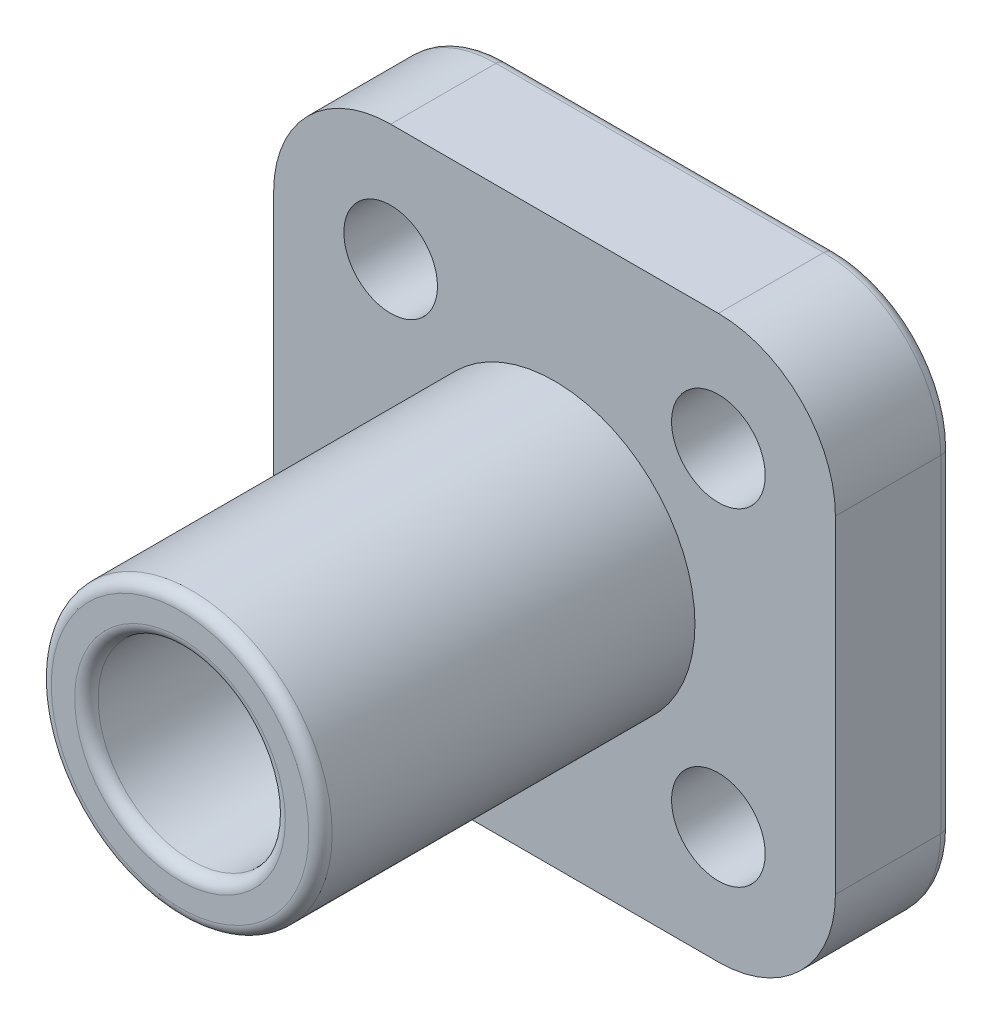
ISO-10303-21;
HEADER;
FILE_DESCRIPTION(('STEP AP214'),'2;1');
FILE_NAME('part.step','',(''),(''),'','','');
FILE_SCHEMA(('AUTOMOTIVE_DESIGN { 1 0 10303 214 1 1 1 1 }'));
ENDSEC;
DATA;
#1=APPLICATION_CONTEXT('core data for automotive mechanical design processes');
#2=APPLICATION_PROTOCOL_DEFINITION('international standard','automotive_design',2000,#1);
#3=PRODUCT_CONTEXT('',#1,'mechanical');
#4=PRODUCT('Part','Part','',(#3));
#5=PRODUCT_RELATED_PRODUCT_CATEGORY('part','',(#4));
#6=PRODUCT_DEFINITION_FORMATION('','',#4);
#7=PRODUCT_DEFINITION_CONTEXT('part definition',#1,'design');
#8=PRODUCT_DEFINITION('design','',#6,#7);
#9=PRODUCT_DEFINITION_SHAPE('','',#8);
#10=(LENGTH_UNIT() NAMED_UNIT(*) SI_UNIT(.MILLI.,.METRE.));
#11=(NAMED_UNIT(*) PLANE_ANGLE_UNIT() SI_UNIT($,.RADIAN.));
#12=(NAMED_UNIT(*) SI_UNIT($,.STERADIAN.) SOLID_ANGLE_UNIT());
#13=UNCERTAINTY_MEASURE_WITH_UNIT(LENGTH_MEASURE(1.E-05),#10,'distance_accuracy_value','');
#14=(GEOMETRIC_REPRESENTATION_CONTEXT(3) GLOBAL_UNCERTAINTY_ASSIGNED_CONTEXT((#13)) GLOBAL_UNIT_ASSIGNED_CONTEXT((#10,
#11,#12)) REPRESENTATION_CONTEXT('',''));
#15=CARTESIAN_POINT('',(0.,0.,0.));
#16=DIRECTION('',(0.,0.,1.));
#17=DIRECTION('',(1.,0.,0.));
#18=AXIS2_PLACEMENT_3D('',#15,#16,#17);
#19=CARTESIAN_POINT('',(7.,-7.,5.));
#20=DIRECTION('',(0.,0.,1.));
#21=DIRECTION('',(1.,0.,0.));
#22=AXIS2_PLACEMENT_3D('',#19,#20,#21);
#23=PLANE('',#22);
#24=CARTESIAN_POINT('',(0.,0.,5.));
#25=DIRECTION('',(0.,0.,1.));
#26=DIRECTION('',(1.,0.,0.));
#27=AXIS2_PLACEMENT_3D('',#24,#25,#26);
#28=CIRCLE('',#27,6.);
#29=CARTESIAN_POINT('',(6.,0.,5.));
#30=VERTEX_POINT('',#29);
#31=EDGE_CURVE('E252',#30,#30,#28,.T.);
#32=ORIENTED_EDGE('',*,*,#31,.F.);
#33=EDGE_LOOP('',(#32));
#34=FACE_BOUND('',#33,.T.);
#35=CARTESIAN_POINT('',(7.,-7.,5.));
#36=DIRECTION('',(0.,0.,1.));
#37=DIRECTION('',(1.,0.,0.));
#38=AXIS2_PLACEMENT_3D('',#35,#36,#37);
#39=CIRCLE('',#38,2.);
#40=CARTESIAN_POINT('',(9.,-7.,5.));
#41=VERTEX_POINT('',#40);
#42=EDGE_CURVE('E262',#41,#41,#39,.T.);
#43=ORIENTED_EDGE('',*,*,#42,.F.);
#44=EDGE_LOOP('',(#43));
#45=FACE_BOUND('',#44,.T.);
#46=CARTESIAN_POINT('',(-7.,7.,5.));
#47=DIRECTION('',(0.,0.,1.));
#48=DIRECTION('',(1.,0.,0.));
#49=AXIS2_PLACEMENT_3D('',#46,#47,#48);
#50=CIRCLE('',#49,2.);
#51=CARTESIAN_POINT('',(-5.,7.,5.));
#52=VERTEX_POINT('',#51);
#53=EDGE_CURVE('E152',#52,#52,#50,.T.);
#54=ORIENTED_EDGE('',*,*,#53,.F.);
#55=EDGE_LOOP('',(#54));
#56=FACE_BOUND('',#55,.T.);
#57=CARTESIAN_POINT('',(7.,-7.,5.));
#58=DIRECTION('',(0.,0.,1.));
#59=DIRECTION('',(1.,0.,0.));
#60=AXIS2_PLACEMENT_3D('',#57,#58,#59);
#61=CIRCLE('',#60,5.);
#62=CARTESIAN_POINT('',(7.,-12.,5.));
#63=VERTEX_POINT('',#62);
#64=CARTESIAN_POINT('',(12.,-7.,5.));
#65=VERTEX_POINT('',#64);
#66=EDGE_CURVE('E145',#63,#65,#61,.T.);
#67=ORIENTED_EDGE('',*,*,#66,.T.);
#68=DIRECTION('',(0.,1.,0.));
#69=VECTOR('',#68,1.);
#70=CARTESIAN_POINT('',(12.,-7.,5.));
#71=LINE('',#70,#69);
#72=CARTESIAN_POINT('',(12.,7.,5.));
#73=VERTEX_POINT('',#72);
#74=EDGE_CURVE('E133',#65,#73,#71,.T.);
#75=ORIENTED_EDGE('',*,*,#74,.T.);
#76=CARTESIAN_POINT('',(7.,7.,5.));
#77=DIRECTION('',(0.,0.,1.));
#78=DIRECTION('',(1.,0.,0.));
#79=AXIS2_PLACEMENT_3D('',#76,#77,#78);
#80=CIRCLE('',#79,5.);
#81=CARTESIAN_POINT('',(7.,12.,5.));
#82=VERTEX_POINT('',#81);
#83=EDGE_CURVE('E144',#73,#82,#80,.T.);
#84=ORIENTED_EDGE('',*,*,#83,.T.);
#85=DIRECTION('',(-1.,0.,0.));
#86=VECTOR('',#85,1.);
#87=CARTESIAN_POINT('',(7.,12.,5.));
#88=LINE('',#87,#86);
#89=CARTESIAN_POINT('',(-7.,12.,5.));
#90=VERTEX_POINT('',#89);
#91=EDGE_CURVE('E273',#82,#90,#88,.T.);
#92=ORIENTED_EDGE('',*,*,#91,.T.);
#93=CARTESIAN_POINT('',(-7.,7.,5.));
#94=DIRECTION('',(0.,0.,1.));
#95=DIRECTION('',(1.,0.,0.));
#96=AXIS2_PLACEMENT_3D('',#93,#94,#95);
#97=CIRCLE('',#96,5.);
#98=CARTESIAN_POINT('',(-12.,7.,5.));
#99=VERTEX_POINT('',#98);
#100=EDGE_CURVE('E275',#90,#99,#97,.T.);
#101=ORIENTED_EDGE('',*,*,#100,.T.);
#102=DIRECTION('',(0.,-1.,0.));
#103=VECTOR('',#102,1.);
#104=CARTESIAN_POINT('',(-12.,-7.,5.));
#105=LINE('',#104,#103);
#106=CARTESIAN_POINT('',(-12.,-7.,5.));
#107=VERTEX_POINT('',#106);
#108=EDGE_CURVE('E277',#99,#107,#105,.T.);
#109=ORIENTED_EDGE('',*,*,#108,.T.);
#110=CARTESIAN_POINT('',(-7.,-7.,5.));
#111=DIRECTION('',(0.,0.,1.));
#112=DIRECTION('',(-1.,0.,0.));
#113=AXIS2_PLACEMENT_3D('',#110,#111,#112);
#114=CIRCLE('',#113,5.);
#115=CARTESIAN_POINT('',(-7.,-12.,5.));
#116=VERTEX_POINT('',#115);
#117=EDGE_CURVE('E279',#107,#116,#114,.T.);
#118=ORIENTED_EDGE('',*,*,#117,.T.);
#119=DIRECTION('',(1.,0.,0.));
#120=VECTOR('',#119,1.);
#121=CARTESIAN_POINT('',(7.,-12.,5.));
#122=LINE('',#121,#120);
#123=EDGE_CURVE('E150',#116,#63,#122,.T.);
#124=ORIENTED_EDGE('',*,*,#123,.T.);
#125=EDGE_LOOP('',(#67,#75,#84,#92,#101,#109,#118,#124));
#126=FACE_BOUND('',#125,.T.);
#127=CARTESIAN_POINT('',(7.,7.,5.));
#128=DIRECTION('',(0.,0.,1.));
#129=DIRECTION('',(1.,0.,0.));
#130=AXIS2_PLACEMENT_3D('',#127,#128,#129);
#131=CIRCLE('',#130,2.);
#132=CARTESIAN_POINT('',(9.,7.,5.));
#133=VERTEX_POINT('',#132);
#134=EDGE_CURVE('E267',#133,#133,#131,.T.);
#135=ORIENTED_EDGE('',*,*,#134,.F.);
#136=EDGE_LOOP('',(#135));
#137=FACE_BOUND('',#136,.T.);
#138=CARTESIAN_POINT('',(-7.,-7.,5.));
#139=DIRECTION('',(0.,0.,1.));
#140=DIRECTION('',(1.,0.,0.));
#141=AXIS2_PLACEMENT_3D('',#138,#139,#140);
#142=CIRCLE('',#141,2.);
#143=CARTESIAN_POINT('',(-5.,-7.,5.));
#144=VERTEX_POINT('',#143);
#145=EDGE_CURVE('E257',#144,#144,#142,.T.);
#146=ORIENTED_EDGE('',*,*,#145,.F.);
#147=EDGE_LOOP('',(#146));
#148=FACE_BOUND('',#147,.T.);
#149=ADVANCED_FACE('F39',(#34,#45,#56,#126,#137,#148),#23,.T.);
#150=CARTESIAN_POINT('',(7.,-7.,0.));
#151=DIRECTION('',(0.,0.,1.));
#152=DIRECTION('',(1.,0.,0.));
#153=AXIS2_PLACEMENT_3D('',#150,#151,#152);
#154=PLANE('',#153);
#155=CARTESIAN_POINT('',(-7.,-7.,0.));
#156=DIRECTION('',(0.,0.,1.));
#157=DIRECTION('',(1.,0.,0.));
#158=AXIS2_PLACEMENT_3D('',#155,#156,#157);
#159=CIRCLE('',#158,2.5);
#160=CARTESIAN_POINT('',(-4.5,-7.,0.));
#161=VERTEX_POINT('',#160);
#162=EDGE_CURVE('E191',#161,#161,#159,.T.);
#163=ORIENTED_EDGE('',*,*,#162,.T.);
#164=EDGE_LOOP('',(#163));
#165=FACE_BOUND('',#164,.T.);
#166=CARTESIAN_POINT('',(7.,-7.,0.));
#167=DIRECTION('',(0.,0.,1.));
#168=DIRECTION('',(1.,0.,0.));
#169=AXIS2_PLACEMENT_3D('',#166,#167,#168);
#170=CIRCLE('',#169,2.5);
#171=CARTESIAN_POINT('',(9.5,-7.,0.));
#172=VERTEX_POINT('',#171);
#173=EDGE_CURVE('E188',#172,#172,#170,.T.);
#174=ORIENTED_EDGE('',*,*,#173,.T.);
#175=EDGE_LOOP('',(#174));
#176=FACE_BOUND('',#175,.T.);
#177=CARTESIAN_POINT('',(7.,7.,0.));
#178=DIRECTION('',(0.,0.,1.));
#179=DIRECTION('',(1.,0.,0.));
#180=AXIS2_PLACEMENT_3D('',#177,#178,#179);
#181=CIRCLE('',#180,2.5);
#182=CARTESIAN_POINT('',(9.5,7.,0.));
#183=VERTEX_POINT('',#182);
#184=EDGE_CURVE('E185',#183,#183,#181,.T.);
#185=ORIENTED_EDGE('',*,*,#184,.T.);
#186=EDGE_LOOP('',(#185));
#187=FACE_BOUND('',#186,.T.);
#188=CARTESIAN_POINT('',(-7.,7.,0.));
#189=DIRECTION('',(0.,0.,1.));
#190=DIRECTION('',(1.,0.,0.));
#191=AXIS2_PLACEMENT_3D('',#188,#189,#190);
#192=CIRCLE('',#191,2.5);
#193=CARTESIAN_POINT('',(-4.5,7.,0.));
#194=VERTEX_POINT('',#193);
#195=EDGE_CURVE('E182',#194,#194,#192,.T.);
#196=ORIENTED_EDGE('',*,*,#195,.T.);
#197=EDGE_LOOP('',(#196));
#198=FACE_BOUND('',#197,.T.);
#199=CARTESIAN_POINT('',(7.,7.,0.));
#200=DIRECTION('',(0.,0.,1.));
#201=DIRECTION('',(1.,0.,0.));
#202=AXIS2_PLACEMENT_3D('',#199,#200,#201);
#203=CIRCLE('',#202,4.5);
#204=CARTESIAN_POINT('',(7.,11.5,0.));
#205=VERTEX_POINT('',#204);
#206=CARTESIAN_POINT('',(11.5,7.,0.));
#207=VERTEX_POINT('',#206);
#208=EDGE_CURVE('E177',#205,#207,#203,.F.);
#209=ORIENTED_EDGE('',*,*,#208,.T.);
#210=DIRECTION('',(0.,1.,0.));
#211=VECTOR('',#210,1.);
#212=CARTESIAN_POINT('',(11.5,-7.,0.));
#213=LINE('',#212,#211);
#214=CARTESIAN_POINT('',(11.5,-7.,0.));
#215=VERTEX_POINT('',#214);
#216=EDGE_CURVE('E179',#207,#215,#213,.F.);
#217=ORIENTED_EDGE('',*,*,#216,.T.);
#218=CARTESIAN_POINT('',(7.,-7.,0.));
#219=DIRECTION('',(0.,0.,1.));
#220=DIRECTION('',(1.,0.,0.));
#221=AXIS2_PLACEMENT_3D('',#218,#219,#220);
#222=CIRCLE('',#221,4.5);
#223=CARTESIAN_POINT('',(7.,-11.5,0.));
#224=VERTEX_POINT('',#223);
#225=EDGE_CURVE('E160',#215,#224,#222,.F.);
#226=ORIENTED_EDGE('',*,*,#225,.T.);
#227=DIRECTION('',(1.,0.,0.));
#228=VECTOR('',#227,1.);
#229=CARTESIAN_POINT('',(7.,-11.5,0.));
#230=LINE('',#229,#228);
#231=CARTESIAN_POINT('',(-7.,-11.5,0.));
#232=VERTEX_POINT('',#231);
#233=EDGE_CURVE('E167',#224,#232,#230,.F.);
#234=ORIENTED_EDGE('',*,*,#233,.T.);
#235=CARTESIAN_POINT('',(-7.,-7.,0.));
#236=DIRECTION('',(0.,0.,1.));
#237=DIRECTION('',(1.,0.,0.));
#238=AXIS2_PLACEMENT_3D('',#235,#236,#237);
#239=CIRCLE('',#238,4.5);
#240=CARTESIAN_POINT('',(-11.5,-7.,0.));
#241=VERTEX_POINT('',#240);
#242=EDGE_CURVE('E169',#232,#241,#239,.F.);
#243=ORIENTED_EDGE('',*,*,#242,.T.);
#244=DIRECTION('',(0.,-1.,0.));
#245=VECTOR('',#244,1.);
#246=CARTESIAN_POINT('',(-11.5,-7.,0.));
#247=LINE('',#246,#245);
#248=CARTESIAN_POINT('',(-11.5,7.,0.));
#249=VERTEX_POINT('',#248);
#250=EDGE_CURVE('E171',#241,#249,#247,.F.);
#251=ORIENTED_EDGE('',*,*,#250,.T.);
#252=CARTESIAN_POINT('',(-7.,7.,0.));
#253=DIRECTION('',(0.,0.,1.));
#254=DIRECTION('',(1.,0.,0.));
#255=AXIS2_PLACEMENT_3D('',#252,#253,#254);
#256=CIRCLE('',#255,4.5);
#257=CARTESIAN_POINT('',(-7.,11.5,0.));
#258=VERTEX_POINT('',#257);
#259=EDGE_CURVE('E173',#249,#258,#256,.F.);
#260=ORIENTED_EDGE('',*,*,#259,.T.);
#261=DIRECTION('',(-1.,0.,0.));
#262=VECTOR('',#261,1.);
#263=CARTESIAN_POINT('',(7.,11.5,0.));
#264=LINE('',#263,#262);
#265=EDGE_CURVE('E175',#258,#205,#264,.F.);
#266=ORIENTED_EDGE('',*,*,#265,.T.);
#267=EDGE_LOOP('',(#209,#217,#226,#234,#243,#251,#260,#266));
#268=FACE_BOUND('',#267,.T.);
#269=CARTESIAN_POINT('',(0.,0.,0.));
#270=DIRECTION('',(0.,0.,1.));
#271=DIRECTION('',(1.,0.,0.));
#272=AXIS2_PLACEMENT_3D('',#269,#270,#271);
#273=CIRCLE('',#272,4.5);
#274=CARTESIAN_POINT('',(4.5,0.,0.));
#275=VERTEX_POINT('',#274);
#276=EDGE_CURVE('E157',#275,#275,#273,.T.);
#277=ORIENTED_EDGE('',*,*,#276,.T.);
#278=EDGE_LOOP('',(#277));
#279=FACE_BOUND('',#278,.T.);
#280=ADVANCED_FACE('F313',(#165,#176,#187,#198,#268,#279),#154,.F.);
#281=CARTESIAN_POINT('',(7.,-7.,5.));
#282=DIRECTION('',(0.,0.,-1.));
#283=DIRECTION('',(-1.,0.,0.));
#284=AXIS2_PLACEMENT_3D('',#281,#282,#283);
#285=CYLINDRICAL_SURFACE('',#284,5.);
#286=DIRECTION('',(0.,0.,-1.));
#287=VECTOR('',#286,1.);
#288=CARTESIAN_POINT('',(7.,-12.,5.));
#289=LINE('',#288,#287);
#290=CARTESIAN_POINT('',(7.,-12.,0.5));
#291=VERTEX_POINT('',#290);
#292=EDGE_CURVE('E282',#63,#291,#289,.T.);
#293=ORIENTED_EDGE('',*,*,#292,.T.);
#294=CARTESIAN_POINT('',(7.,-7.,0.5));
#295=DIRECTION('',(0.,0.,1.));
#296=DIRECTION('',(1.,0.,0.));
#297=AXIS2_PLACEMENT_3D('',#294,#295,#296);
#298=CIRCLE('',#297,5.);
#299=CARTESIAN_POINT('',(12.,-7.,0.5));
#300=VERTEX_POINT('',#299);
#301=EDGE_CURVE('E156',#291,#300,#298,.T.);
#302=ORIENTED_EDGE('',*,*,#301,.T.);
#303=DIRECTION('',(0.,0.,-1.));
#304=VECTOR('',#303,1.);
#305=CARTESIAN_POINT('',(12.,-7.,5.));
#306=LINE('',#305,#304);
#307=EDGE_CURVE('E138',#65,#300,#306,.T.);
#308=ORIENTED_EDGE('',*,*,#307,.F.);
#309=ORIENTED_EDGE('',*,*,#66,.F.);
#310=EDGE_LOOP('',(#293,#302,#308,#309));
#311=FACE_BOUND('',#310,.T.);
#312=ADVANCED_FACE('F154',(#311),#285,.T.);
#313=CARTESIAN_POINT('',(12.,-7.,5.));
#314=DIRECTION('',(-1.,0.,0.));
#315=DIRECTION('',(0.,0.,1.));
#316=AXIS2_PLACEMENT_3D('',#313,#314,#315);
#317=PLANE('',#316);
#318=ORIENTED_EDGE('',*,*,#307,.T.);
#319=DIRECTION('',(0.,1.,0.));
#320=VECTOR('',#319,1.);
#321=CARTESIAN_POINT('',(12.,-7.,0.5));
#322=LINE('',#321,#320);
#323=CARTESIAN_POINT('',(12.,7.,0.5));
#324=VERTEX_POINT('',#323);
#325=EDGE_CURVE('E206',#300,#324,#322,.T.);
#326=ORIENTED_EDGE('',*,*,#325,.T.);
#327=DIRECTION('',(0.,0.,-1.));
#328=VECTOR('',#327,1.);
#329=CARTESIAN_POINT('',(12.,7.,5.));
#330=LINE('',#329,#328);
#331=EDGE_CURVE('E141',#73,#324,#330,.T.);
#332=ORIENTED_EDGE('',*,*,#331,.F.);
#333=ORIENTED_EDGE('',*,*,#74,.F.);
#334=EDGE_LOOP('',(#318,#326,#332,#333));
#335=FACE_BOUND('',#334,.T.);
#336=ADVANCED_FACE('F135',(#335),#317,.F.);
#337=CARTESIAN_POINT('',(7.,7.,5.));
#338=DIRECTION('',(0.,0.,-1.));
#339=DIRECTION('',(-1.,0.,0.));
#340=AXIS2_PLACEMENT_3D('',#337,#338,#339);
#341=CYLINDRICAL_SURFACE('',#340,5.);
#342=ORIENTED_EDGE('',*,*,#331,.T.);
#343=CARTESIAN_POINT('',(7.,7.,0.5));
#344=DIRECTION('',(0.,0.,1.));
#345=DIRECTION('',(1.,0.,0.));
#346=AXIS2_PLACEMENT_3D('',#343,#344,#345);
#347=CIRCLE('',#346,5.);
#348=CARTESIAN_POINT('',(7.,12.,0.5));
#349=VERTEX_POINT('',#348);
#350=EDGE_CURVE('E208',#324,#349,#347,.T.);
#351=ORIENTED_EDGE('',*,*,#350,.T.);
#352=DIRECTION('',(0.,0.,-1.));
#353=VECTOR('',#352,1.);
#354=CARTESIAN_POINT('',(7.,12.,5.));
#355=LINE('',#354,#353);
#356=EDGE_CURVE('E162',#82,#349,#355,.T.);
#357=ORIENTED_EDGE('',*,*,#356,.F.);
#358=ORIENTED_EDGE('',*,*,#83,.F.);
#359=EDGE_LOOP('',(#342,#351,#357,#358));
#360=FACE_BOUND('',#359,.T.);
#361=ADVANCED_FACE('F341',(#360),#341,.T.);
#362=CARTESIAN_POINT('',(7.,12.,5.));
#363=DIRECTION('',(0.,-1.,0.));
#364=DIRECTION('',(1.,0.,0.));
#365=AXIS2_PLACEMENT_3D('',#362,#363,#364);
#366=PLANE('',#365);
#367=ORIENTED_EDGE('',*,*,#356,.T.);
#368=DIRECTION('',(-1.,0.,0.));
#369=VECTOR('',#368,1.);
#370=CARTESIAN_POINT('',(7.,12.,0.5));
#371=LINE('',#370,#369);
#372=CARTESIAN_POINT('',(-7.,12.,0.5));
#373=VERTEX_POINT('',#372);
#374=EDGE_CURVE('E210',#349,#373,#371,.T.);
#375=ORIENTED_EDGE('',*,*,#374,.T.);
#376=DIRECTION('',(0.,0.,-1.));
#377=VECTOR('',#376,1.);
#378=CARTESIAN_POINT('',(-7.,12.,5.));
#379=LINE('',#378,#377);
#380=EDGE_CURVE('E291',#90,#373,#379,.T.);
#381=ORIENTED_EDGE('',*,*,#380,.F.);
#382=ORIENTED_EDGE('',*,*,#91,.F.);
#383=EDGE_LOOP('',(#367,#375,#381,#382));
#384=FACE_BOUND('',#383,.T.);
#385=ADVANCED_FACE('F298',(#384),#366,.F.);
#386=CARTESIAN_POINT('',(-7.,7.,5.));
#387=DIRECTION('',(0.,0.,-1.));
#388=DIRECTION('',(-1.,0.,0.));
#389=AXIS2_PLACEMENT_3D('',#386,#387,#388);
#390=CYLINDRICAL_SURFACE('',#389,5.);
#391=ORIENTED_EDGE('',*,*,#380,.T.);
#392=CARTESIAN_POINT('',(-7.,7.,0.5));
#393=DIRECTION('',(0.,0.,1.));
#394=DIRECTION('',(1.,0.,0.));
#395=AXIS2_PLACEMENT_3D('',#392,#393,#394);
#396=CIRCLE('',#395,5.);
#397=CARTESIAN_POINT('',(-12.,7.,0.5));
#398=VERTEX_POINT('',#397);
#399=EDGE_CURVE('E212',#373,#398,#396,.T.);
#400=ORIENTED_EDGE('',*,*,#399,.T.);
#401=DIRECTION('',(0.,0.,-1.));
#402=VECTOR('',#401,1.);
#403=CARTESIAN_POINT('',(-12.,7.,5.));
#404=LINE('',#403,#402);
#405=EDGE_CURVE('E288',#99,#398,#404,.T.);
#406=ORIENTED_EDGE('',*,*,#405,.F.);
#407=ORIENTED_EDGE('',*,*,#100,.F.);
#408=EDGE_LOOP('',(#391,#400,#406,#407));
#409=FACE_BOUND('',#408,.T.);
#410=ADVANCED_FACE('F334',(#409),#390,.T.);
#411=CARTESIAN_POINT('',(-12.,-7.,5.));
#412=DIRECTION('',(1.,0.,0.));
#413=DIRECTION('',(0.,1.,0.));
#414=AXIS2_PLACEMENT_3D('',#411,#412,#413);
#415=PLANE('',#414);
#416=ORIENTED_EDGE('',*,*,#405,.T.);
#417=DIRECTION('',(0.,-1.,0.));
#418=VECTOR('',#417,1.);
#419=CARTESIAN_POINT('',(-12.,-7.,0.5));
#420=LINE('',#419,#418);
#421=CARTESIAN_POINT('',(-12.,-7.,0.5));
#422=VERTEX_POINT('',#421);
#423=EDGE_CURVE('E214',#398,#422,#420,.T.);
#424=ORIENTED_EDGE('',*,*,#423,.T.);
#425=DIRECTION('',(0.,0.,-1.));
#426=VECTOR('',#425,1.);
#427=CARTESIAN_POINT('',(-12.,-7.,5.));
#428=LINE('',#427,#426);
#429=EDGE_CURVE('E286',#107,#422,#428,.T.);
#430=ORIENTED_EDGE('',*,*,#429,.F.);
#431=ORIENTED_EDGE('',*,*,#108,.F.);
#432=EDGE_LOOP('',(#416,#424,#430,#431));
#433=FACE_BOUND('',#432,.T.);
#434=ADVANCED_FACE('F338',(#433),#415,.F.);
#435=CARTESIAN_POINT('',(-7.,-7.,5.));
#436=DIRECTION('',(0.,0.,-1.));
#437=DIRECTION('',(-1.,0.,0.));
#438=AXIS2_PLACEMENT_3D('',#435,#436,#437);
#439=CYLINDRICAL_SURFACE('',#438,5.);
#440=ORIENTED_EDGE('',*,*,#429,.T.);
#441=CARTESIAN_POINT('',(-7.,-7.,0.5));
#442=DIRECTION('',(0.,0.,1.));
#443=DIRECTION('',(1.,0.,0.));
#444=AXIS2_PLACEMENT_3D('',#441,#442,#443);
#445=CIRCLE('',#444,5.);
#446=CARTESIAN_POINT('',(-7.,-12.,0.5));
#447=VERTEX_POINT('',#446);
#448=EDGE_CURVE('E64',#422,#447,#445,.T.);
#449=ORIENTED_EDGE('',*,*,#448,.T.);
#450=DIRECTION('',(0.,0.,-1.));
#451=VECTOR('',#450,1.);
#452=CARTESIAN_POINT('',(-7.,-12.,5.));
#453=LINE('',#452,#451);
#454=EDGE_CURVE('E284',#116,#447,#453,.T.);
#455=ORIENTED_EDGE('',*,*,#454,.F.);
#456=ORIENTED_EDGE('',*,*,#117,.F.);
#457=EDGE_LOOP('',(#440,#449,#455,#456));
#458=FACE_BOUND('',#457,.T.);
#459=ADVANCED_FACE('F366',(#458),#439,.T.);
#460=CARTESIAN_POINT('',(7.,-12.,5.));
#461=DIRECTION('',(0.,1.,0.));
#462=DIRECTION('',(0.,0.,1.));
#463=AXIS2_PLACEMENT_3D('',#460,#461,#462);
#464=PLANE('',#463);
#465=ORIENTED_EDGE('',*,*,#454,.T.);
#466=DIRECTION('',(1.,0.,0.));
#467=VECTOR('',#466,1.);
#468=CARTESIAN_POINT('',(7.,-12.,0.5));
#469=LINE('',#468,#467);
#470=EDGE_CURVE('E56',#447,#291,#469,.T.);
#471=ORIENTED_EDGE('',*,*,#470,.T.);
#472=ORIENTED_EDGE('',*,*,#292,.F.);
#473=ORIENTED_EDGE('',*,*,#123,.F.);
#474=EDGE_LOOP('',(#465,#471,#472,#473));
#475=FACE_BOUND('',#474,.T.);
#476=ADVANCED_FACE('F363',(#475),#464,.F.);
#477=CARTESIAN_POINT('',(-7.,7.,5.));
#478=DIRECTION('',(0.,0.,-1.));
#479=DIRECTION('',(-1.,0.,0.));
#480=AXIS2_PLACEMENT_3D('',#477,#478,#479);
#481=CYLINDRICAL_SURFACE('',#480,2.);
#482=CARTESIAN_POINT('',(-7.,7.,0.5));
#483=DIRECTION('',(0.,0.,1.));
#484=DIRECTION('',(1.,0.,0.));
#485=AXIS2_PLACEMENT_3D('',#482,#483,#484);
#486=CIRCLE('',#485,2.);
#487=CARTESIAN_POINT('',(-5.,7.,0.5));
#488=VERTEX_POINT('',#487);
#489=EDGE_CURVE('E203',#488,#488,#486,.F.);
#490=ORIENTED_EDGE('',*,*,#489,.T.);
#491=EDGE_LOOP('',(#490));
#492=FACE_BOUND('',#491,.T.);
#493=ORIENTED_EDGE('',*,*,#53,.T.);
#494=EDGE_LOOP('',(#493));
#495=FACE_BOUND('',#494,.T.);
#496=ADVANCED_FACE('F360',(#492,#495),#481,.F.);
#497=CARTESIAN_POINT('',(7.,7.,5.));
#498=DIRECTION('',(0.,0.,-1.));
#499=DIRECTION('',(-1.,0.,0.));
#500=AXIS2_PLACEMENT_3D('',#497,#498,#499);
#501=CYLINDRICAL_SURFACE('',#500,2.);
#502=CARTESIAN_POINT('',(7.,7.,0.5));
#503=DIRECTION('',(0.,0.,1.));
#504=DIRECTION('',(1.,0.,0.));
#505=AXIS2_PLACEMENT_3D('',#502,#503,#504);
#506=CIRCLE('',#505,2.);
#507=CARTESIAN_POINT('',(9.,7.,0.5));
#508=VERTEX_POINT('',#507);
#509=EDGE_CURVE('E200',#508,#508,#506,.F.);
#510=ORIENTED_EDGE('',*,*,#509,.T.);
#511=EDGE_LOOP('',(#510));
#512=FACE_BOUND('',#511,.T.);
#513=ORIENTED_EDGE('',*,*,#134,.T.);
#514=EDGE_LOOP('',(#513));
#515=FACE_BOUND('',#514,.T.);
#516=ADVANCED_FACE('F394',(#512,#515),#501,.F.);
#517=CARTESIAN_POINT('',(7.,-7.,5.));
#518=DIRECTION('',(0.,0.,-1.));
#519=DIRECTION('',(-1.,0.,0.));
#520=AXIS2_PLACEMENT_3D('',#517,#518,#519);
#521=CYLINDRICAL_SURFACE('',#520,2.);
#522=CARTESIAN_POINT('',(7.,-7.,0.5));
#523=DIRECTION('',(0.,0.,1.));
#524=DIRECTION('',(1.,0.,0.));
#525=AXIS2_PLACEMENT_3D('',#522,#523,#524);
#526=CIRCLE('',#525,2.);
#527=CARTESIAN_POINT('',(9.,-7.,0.5));
#528=VERTEX_POINT('',#527);
#529=EDGE_CURVE('E197',#528,#528,#526,.F.);
#530=ORIENTED_EDGE('',*,*,#529,.T.);
#531=EDGE_LOOP('',(#530));
#532=FACE_BOUND('',#531,.T.);
#533=ORIENTED_EDGE('',*,*,#42,.T.);
#534=EDGE_LOOP('',(#533));
#535=FACE_BOUND('',#534,.T.);
#536=ADVANCED_FACE('F401',(#532,#535),#521,.F.);
#537=CARTESIAN_POINT('',(-7.,-7.,5.));
#538=DIRECTION('',(0.,0.,-1.));
#539=DIRECTION('',(-1.,0.,0.));
#540=AXIS2_PLACEMENT_3D('',#537,#538,#539);
#541=CYLINDRICAL_SURFACE('',#540,2.);
#542=CARTESIAN_POINT('',(-7.,-7.,0.5));
#543=DIRECTION('',(0.,0.,1.));
#544=DIRECTION('',(1.,0.,0.));
#545=AXIS2_PLACEMENT_3D('',#542,#543,#544);
#546=CIRCLE('',#545,2.);
#547=CARTESIAN_POINT('',(-5.,-7.,0.5));
#548=VERTEX_POINT('',#547);
#549=EDGE_CURVE('E194',#548,#548,#546,.F.);
#550=ORIENTED_EDGE('',*,*,#549,.T.);
#551=EDGE_LOOP('',(#550));
#552=FACE_BOUND('',#551,.T.);
#553=ORIENTED_EDGE('',*,*,#145,.T.);
#554=EDGE_LOOP('',(#553));
#555=FACE_BOUND('',#554,.T.);
#556=ADVANCED_FACE('F408',(#552,#555),#541,.F.);
#557=CARTESIAN_POINT('',(0.,0.,21.));
#558=DIRECTION('',(0.,0.,1.));
#559=DIRECTION('',(1.,0.,0.));
#560=AXIS2_PLACEMENT_3D('',#557,#558,#559);
#561=PLANE('',#560);
#562=CARTESIAN_POINT('',(0.,0.,21.));
#563=DIRECTION('',(0.,0.,1.));
#564=DIRECTION('',(1.,0.,0.));
#565=AXIS2_PLACEMENT_3D('',#562,#563,#564);
#566=CIRCLE('',#565,5.5);
#567=CARTESIAN_POINT('',(5.5,0.,21.));
#568=VERTEX_POINT('',#567);
#569=EDGE_CURVE('E48',#568,#568,#566,.T.);
#570=ORIENTED_EDGE('',*,*,#569,.T.);
#571=EDGE_LOOP('',(#570));
#572=FACE_BOUND('',#571,.T.);
#573=CARTESIAN_POINT('',(0.,0.,21.));
#574=DIRECTION('',(0.,0.,1.));
#575=DIRECTION('',(1.,0.,0.));
#576=AXIS2_PLACEMENT_3D('',#573,#574,#575);
#577=CIRCLE('',#576,4.5);
#578=CARTESIAN_POINT('',(4.5,0.,21.));
#579=VERTEX_POINT('',#578);
#580=EDGE_CURVE('E225',#579,#579,#577,.F.);
#581=ORIENTED_EDGE('',*,*,#580,.T.);
#582=EDGE_LOOP('',(#581));
#583=FACE_BOUND('',#582,.T.);
#584=ADVANCED_FACE('F416',(#572,#583),#561,.T.);
#585=CARTESIAN_POINT('',(0.,0.,21.));
#586=DIRECTION('',(0.,0.,-1.));
#587=DIRECTION('',(-1.,0.,0.));
#588=AXIS2_PLACEMENT_3D('',#585,#586,#587);
#589=CYLINDRICAL_SURFACE('',#588,6.);
#590=CARTESIAN_POINT('',(0.,0.,20.5));
#591=DIRECTION('',(0.,0.,1.));
#592=DIRECTION('',(1.,0.,0.));
#593=AXIS2_PLACEMENT_3D('',#590,#591,#592);
#594=CIRCLE('',#593,6.);
#595=CARTESIAN_POINT('',(6.,0.,20.5));
#596=VERTEX_POINT('',#595);
#597=EDGE_CURVE('E12',#596,#596,#594,.F.);
#598=ORIENTED_EDGE('',*,*,#597,.T.);
#599=EDGE_LOOP('',(#598));
#600=FACE_BOUND('',#599,.T.);
#601=ORIENTED_EDGE('',*,*,#31,.T.);
#602=EDGE_LOOP('',(#601));
#603=FACE_BOUND('',#602,.T.);
#604=ADVANCED_FACE('F424',(#600,#603),#589,.T.);
#605=CARTESIAN_POINT('',(0.,0.,21.));
#606=DIRECTION('',(0.,0.,-1.));
#607=DIRECTION('',(-1.,0.,0.));
#608=AXIS2_PLACEMENT_3D('',#605,#606,#607);
#609=CYLINDRICAL_SURFACE('',#608,4.);
#610=CARTESIAN_POINT('',(0.,0.,0.5));
#611=DIRECTION('',(0.,0.,1.));
#612=DIRECTION('',(1.,0.,0.));
#613=AXIS2_PLACEMENT_3D('',#610,#611,#612);
#614=CIRCLE('',#613,4.);
#615=CARTESIAN_POINT('',(4.,0.,0.5));
#616=VERTEX_POINT('',#615);
#617=EDGE_CURVE('E222',#616,#616,#614,.F.);
#618=ORIENTED_EDGE('',*,*,#617,.T.);
#619=EDGE_LOOP('',(#618));
#620=FACE_BOUND('',#619,.T.);
#621=CARTESIAN_POINT('',(0.,0.,20.5));
#622=DIRECTION('',(0.,0.,1.));
#623=DIRECTION('',(1.,0.,0.));
#624=AXIS2_PLACEMENT_3D('',#621,#622,#623);
#625=CIRCLE('',#624,4.);
#626=CARTESIAN_POINT('',(4.,0.,20.5));
#627=VERTEX_POINT('',#626);
#628=EDGE_CURVE('E219',#627,#627,#625,.T.);
#629=ORIENTED_EDGE('',*,*,#628,.T.);
#630=EDGE_LOOP('',(#629));
#631=FACE_BOUND('',#630,.T.);
#632=ADVANCED_FACE('F432',(#620,#631),#609,.F.);
#633=CARTESIAN_POINT('',(-7.,-7.,0.5));
#634=DIRECTION('',(0.,0.,1.));
#635=DIRECTION('',(1.,0.,0.));
#636=AXIS2_PLACEMENT_3D('',#633,#634,#635);
#637=TOROIDAL_SURFACE('',#636,2.5,0.5);
#638=ORIENTED_EDGE('',*,*,#549,.F.);
#639=EDGE_LOOP('',(#638));
#640=FACE_BOUND('',#639,.T.);
#641=ORIENTED_EDGE('',*,*,#162,.F.);
#642=EDGE_LOOP('',(#641));
#643=FACE_BOUND('',#642,.T.);
#644=ADVANCED_FACE('F440',(#640,#643),#637,.T.);
#645=CARTESIAN_POINT('',(7.,-7.,0.5));
#646=DIRECTION('',(0.,0.,1.));
#647=DIRECTION('',(1.,0.,0.));
#648=AXIS2_PLACEMENT_3D('',#645,#646,#647);
#649=TOROIDAL_SURFACE('',#648,2.5,0.5);
#650=ORIENTED_EDGE('',*,*,#529,.F.);
#651=EDGE_LOOP('',(#650));
#652=FACE_BOUND('',#651,.T.);
#653=ORIENTED_EDGE('',*,*,#173,.F.);
#654=EDGE_LOOP('',(#653));
#655=FACE_BOUND('',#654,.T.);
#656=ADVANCED_FACE('F448',(#652,#655),#649,.T.);
#657=CARTESIAN_POINT('',(7.,7.,0.5));
#658=DIRECTION('',(0.,0.,1.));
#659=DIRECTION('',(1.,0.,0.));
#660=AXIS2_PLACEMENT_3D('',#657,#658,#659);
#661=TOROIDAL_SURFACE('',#660,2.5,0.5);
#662=ORIENTED_EDGE('',*,*,#509,.F.);
#663=EDGE_LOOP('',(#662));
#664=FACE_BOUND('',#663,.T.);
#665=ORIENTED_EDGE('',*,*,#184,.F.);
#666=EDGE_LOOP('',(#665));
#667=FACE_BOUND('',#666,.T.);
#668=ADVANCED_FACE('F456',(#664,#667),#661,.T.);
#669=CARTESIAN_POINT('',(-7.,7.,0.5));
#670=DIRECTION('',(0.,0.,1.));
#671=DIRECTION('',(1.,0.,0.));
#672=AXIS2_PLACEMENT_3D('',#669,#670,#671);
#673=TOROIDAL_SURFACE('',#672,2.5,0.5);
#674=ORIENTED_EDGE('',*,*,#489,.F.);
#675=EDGE_LOOP('',(#674));
#676=FACE_BOUND('',#675,.T.);
#677=ORIENTED_EDGE('',*,*,#195,.F.);
#678=EDGE_LOOP('',(#677));
#679=FACE_BOUND('',#678,.T.);
#680=ADVANCED_FACE('F464',(#676,#679),#673,.T.);
#681=CARTESIAN_POINT('',(-11.5,-7.,0.5));
#682=DIRECTION('',(0.,-1.,0.));
#683=DIRECTION('',(1.,0.,0.));
#684=AXIS2_PLACEMENT_3D('',#681,#682,#683);
#685=CYLINDRICAL_SURFACE('',#684,0.5);
#686=CARTESIAN_POINT('',(-11.5,7.,0.5));
#687=DIRECTION('',(0.,1.,0.));
#688=DIRECTION('',(0.,0.,1.));
#689=AXIS2_PLACEMENT_3D('',#686,#687,#688);
#690=CIRCLE('',#689,0.5);
#691=EDGE_CURVE('E245',#249,#398,#690,.T.);
#692=ORIENTED_EDGE('',*,*,#691,.F.);
#693=ORIENTED_EDGE('',*,*,#250,.F.);
#694=CARTESIAN_POINT('',(-11.5,-7.,0.5));
#695=DIRECTION('',(0.,-1.,0.));
#696=DIRECTION('',(0.,0.,-1.));
#697=AXIS2_PLACEMENT_3D('',#694,#695,#696);
#698=CIRCLE('',#697,0.5);
#699=EDGE_CURVE('E43',#422,#241,#698,.T.);
#700=ORIENTED_EDGE('',*,*,#699,.F.);
#701=ORIENTED_EDGE('',*,*,#423,.F.);
#702=EDGE_LOOP('',(#692,#693,#700,#701));
#703=FACE_BOUND('',#702,.T.);
#704=ADVANCED_FACE('F329',(#703),#685,.T.);
#705=CARTESIAN_POINT('',(-7.,-7.,0.5));
#706=DIRECTION('',(0.,0.,1.));
#707=DIRECTION('',(1.,0.,0.));
#708=AXIS2_PLACEMENT_3D('',#705,#706,#707);
#709=TOROIDAL_SURFACE('',#708,4.5,0.5);
#710=ORIENTED_EDGE('',*,*,#699,.T.);
#711=ORIENTED_EDGE('',*,*,#242,.F.);
#712=CARTESIAN_POINT('',(-7.,-11.5,0.5));
#713=DIRECTION('',(1.,0.,0.));
#714=DIRECTION('',(0.,0.,-1.));
#715=AXIS2_PLACEMENT_3D('',#712,#713,#714);
#716=CIRCLE('',#715,0.5);
#717=EDGE_CURVE('E243',#447,#232,#716,.T.);
#718=ORIENTED_EDGE('',*,*,#717,.F.);
#719=ORIENTED_EDGE('',*,*,#448,.F.);
#720=EDGE_LOOP('',(#710,#711,#718,#719));
#721=FACE_BOUND('',#720,.T.);
#722=ADVANCED_FACE('F326',(#721),#709,.T.);
#723=CARTESIAN_POINT('',(-7.,7.,0.5));
#724=DIRECTION('',(0.,0.,1.));
#725=DIRECTION('',(1.,0.,0.));
#726=AXIS2_PLACEMENT_3D('',#723,#724,#725);
#727=TOROIDAL_SURFACE('',#726,4.5,0.5);
#728=ORIENTED_EDGE('',*,*,#691,.T.);
#729=ORIENTED_EDGE('',*,*,#399,.F.);
#730=CARTESIAN_POINT('',(-7.,11.5,0.5));
#731=DIRECTION('',(1.,0.,0.));
#732=DIRECTION('',(0.,0.,-1.));
#733=AXIS2_PLACEMENT_3D('',#730,#731,#732);
#734=CIRCLE('',#733,0.5);
#735=EDGE_CURVE('E240',#258,#373,#734,.T.);
#736=ORIENTED_EDGE('',*,*,#735,.F.);
#737=ORIENTED_EDGE('',*,*,#259,.F.);
#738=EDGE_LOOP('',(#728,#729,#736,#737));
#739=FACE_BOUND('',#738,.T.);
#740=ADVANCED_FACE('F331',(#739),#727,.T.);
#741=CARTESIAN_POINT('',(7.,-11.5,0.5));
#742=DIRECTION('',(1.,0.,0.));
#743=DIRECTION('',(0.,0.,-1.));
#744=AXIS2_PLACEMENT_3D('',#741,#742,#743);
#745=CYLINDRICAL_SURFACE('',#744,0.5);
#746=ORIENTED_EDGE('',*,*,#717,.T.);
#747=ORIENTED_EDGE('',*,*,#233,.F.);
#748=CARTESIAN_POINT('',(7.,-11.5,0.5));
#749=DIRECTION('',(1.,0.,0.));
#750=DIRECTION('',(0.,0.,-1.));
#751=AXIS2_PLACEMENT_3D('',#748,#749,#750);
#752=CIRCLE('',#751,0.5);
#753=EDGE_CURVE('E237',#291,#224,#752,.T.);
#754=ORIENTED_EDGE('',*,*,#753,.F.);
#755=ORIENTED_EDGE('',*,*,#470,.F.);
#756=EDGE_LOOP('',(#746,#747,#754,#755));
#757=FACE_BOUND('',#756,.T.);
#758=ADVANCED_FACE('F324',(#757),#745,.T.);
#759=CARTESIAN_POINT('',(7.,11.5,0.5));
#760=DIRECTION('',(-1.,0.,0.));
#761=DIRECTION('',(0.,-1.,0.));
#762=AXIS2_PLACEMENT_3D('',#759,#760,#761);
#763=CYLINDRICAL_SURFACE('',#762,0.5);
#764=ORIENTED_EDGE('',*,*,#735,.T.);
#765=ORIENTED_EDGE('',*,*,#374,.F.);
#766=CARTESIAN_POINT('',(7.,11.5,0.5));
#767=DIRECTION('',(1.,0.,0.));
#768=DIRECTION('',(0.,0.,-1.));
#769=AXIS2_PLACEMENT_3D('',#766,#767,#768);
#770=CIRCLE('',#769,0.5);
#771=EDGE_CURVE('E234',#205,#349,#770,.T.);
#772=ORIENTED_EDGE('',*,*,#771,.F.);
#773=ORIENTED_EDGE('',*,*,#265,.F.);
#774=EDGE_LOOP('',(#764,#765,#772,#773));
#775=FACE_BOUND('',#774,.T.);
#776=ADVANCED_FACE('F303',(#775),#763,.T.);
#777=CARTESIAN_POINT('',(7.,-7.,0.5));
#778=DIRECTION('',(0.,0.,1.));
#779=DIRECTION('',(1.,0.,0.));
#780=AXIS2_PLACEMENT_3D('',#777,#778,#779);
#781=TOROIDAL_SURFACE('',#780,4.5,0.5);
#782=ORIENTED_EDGE('',*,*,#753,.T.);
#783=ORIENTED_EDGE('',*,*,#225,.F.);
#784=CARTESIAN_POINT('',(11.5,-7.,0.5));
#785=DIRECTION('',(0.,1.,0.));
#786=DIRECTION('',(0.,0.,1.));
#787=AXIS2_PLACEMENT_3D('',#784,#785,#786);
#788=CIRCLE('',#787,0.5);
#789=EDGE_CURVE('E232',#300,#215,#788,.T.);
#790=ORIENTED_EDGE('',*,*,#789,.F.);
#791=ORIENTED_EDGE('',*,*,#301,.F.);
#792=EDGE_LOOP('',(#782,#783,#790,#791));
#793=FACE_BOUND('',#792,.T.);
#794=ADVANCED_FACE('F320',(#793),#781,.T.);
#795=CARTESIAN_POINT('',(7.,7.,0.5));
#796=DIRECTION('',(0.,0.,1.));
#797=DIRECTION('',(1.,0.,0.));
#798=AXIS2_PLACEMENT_3D('',#795,#796,#797);
#799=TOROIDAL_SURFACE('',#798,4.5,0.5);
#800=ORIENTED_EDGE('',*,*,#771,.T.);
#801=ORIENTED_EDGE('',*,*,#350,.F.);
#802=CARTESIAN_POINT('',(11.5,7.,0.5));
#803=DIRECTION('',(0.,-1.,0.));
#804=DIRECTION('',(0.,0.,-1.));
#805=AXIS2_PLACEMENT_3D('',#802,#803,#804);
#806=CIRCLE('',#805,0.5);
#807=EDGE_CURVE('E230',#207,#324,#806,.T.);
#808=ORIENTED_EDGE('',*,*,#807,.F.);
#809=ORIENTED_EDGE('',*,*,#208,.F.);
#810=EDGE_LOOP('',(#800,#801,#808,#809));
#811=FACE_BOUND('',#810,.T.);
#812=ADVANCED_FACE('F309',(#811),#799,.T.);
#813=CARTESIAN_POINT('',(11.5,-7.,0.5));
#814=DIRECTION('',(0.,1.,0.));
#815=DIRECTION('',(0.,0.,1.));
#816=AXIS2_PLACEMENT_3D('',#813,#814,#815);
#817=CYLINDRICAL_SURFACE('',#816,0.5);
#818=ORIENTED_EDGE('',*,*,#789,.T.);
#819=ORIENTED_EDGE('',*,*,#216,.F.);
#820=ORIENTED_EDGE('',*,*,#807,.T.);
#821=ORIENTED_EDGE('',*,*,#325,.F.);
#822=EDGE_LOOP('',(#818,#819,#820,#821));
#823=FACE_BOUND('',#822,.T.);
#824=ADVANCED_FACE('F316',(#823),#817,.T.);
#825=CARTESIAN_POINT('',(0.,0.,0.5));
#826=DIRECTION('',(0.,0.,1.));
#827=DIRECTION('',(1.,0.,0.));
#828=AXIS2_PLACEMENT_3D('',#825,#826,#827);
#829=TOROIDAL_SURFACE('',#828,4.5,0.5);
#830=ORIENTED_EDGE('',*,*,#276,.F.);
#831=EDGE_LOOP('',(#830));
#832=FACE_BOUND('',#831,.T.);
#833=ORIENTED_EDGE('',*,*,#617,.F.);
#834=EDGE_LOOP('',(#833));
#835=FACE_BOUND('',#834,.T.);
#836=ADVANCED_FACE('F521',(#832,#835),#829,.T.);
#837=CARTESIAN_POINT('',(0.,0.,20.5));
#838=DIRECTION('',(0.,0.,1.));
#839=DIRECTION('',(1.,0.,0.));
#840=AXIS2_PLACEMENT_3D('',#837,#838,#839);
#841=TOROIDAL_SURFACE('',#840,5.5,0.5);
#842=ORIENTED_EDGE('',*,*,#597,.F.);
#843=EDGE_LOOP('',(#842));
#844=FACE_BOUND('',#843,.T.);
#845=ORIENTED_EDGE('',*,*,#569,.F.);
#846=EDGE_LOOP('',(#845));
#847=FACE_BOUND('',#846,.T.);
#848=ADVANCED_FACE('F528',(#844,#847),#841,.T.);
#849=CARTESIAN_POINT('',(0.,0.,20.5));
#850=DIRECTION('',(0.,0.,1.));
#851=DIRECTION('',(1.,0.,0.));
#852=AXIS2_PLACEMENT_3D('',#849,#850,#851);
#853=TOROIDAL_SURFACE('',#852,4.5,0.5);
#854=ORIENTED_EDGE('',*,*,#580,.F.);
#855=EDGE_LOOP('',(#854));
#856=FACE_BOUND('',#855,.T.);
#857=ORIENTED_EDGE('',*,*,#628,.F.);
#858=EDGE_LOOP('',(#857));
#859=FACE_BOUND('',#858,.T.);
#860=ADVANCED_FACE('F41',(#856,#859),#853,.T.);
#861=CLOSED_SHELL('',(#149,#280,#312,#336,#361,#385,#410,#434,#459,#476,#496,#516,#536,#556,
#584,#604,#632,#644,#656,#668,#680,#704,#722,#740,#758,#776,#794,#812,#824,#836,#848,#860));
#862=MANIFOLD_SOLID_BREP('B2',#861);
#863=ADVANCED_BREP_SHAPE_REPRESENTATION('',(#18,#862),#14);
#864=SHAPE_DEFINITION_REPRESENTATION(#9,#863);
ENDSEC;
END-ISO-10303-21;
